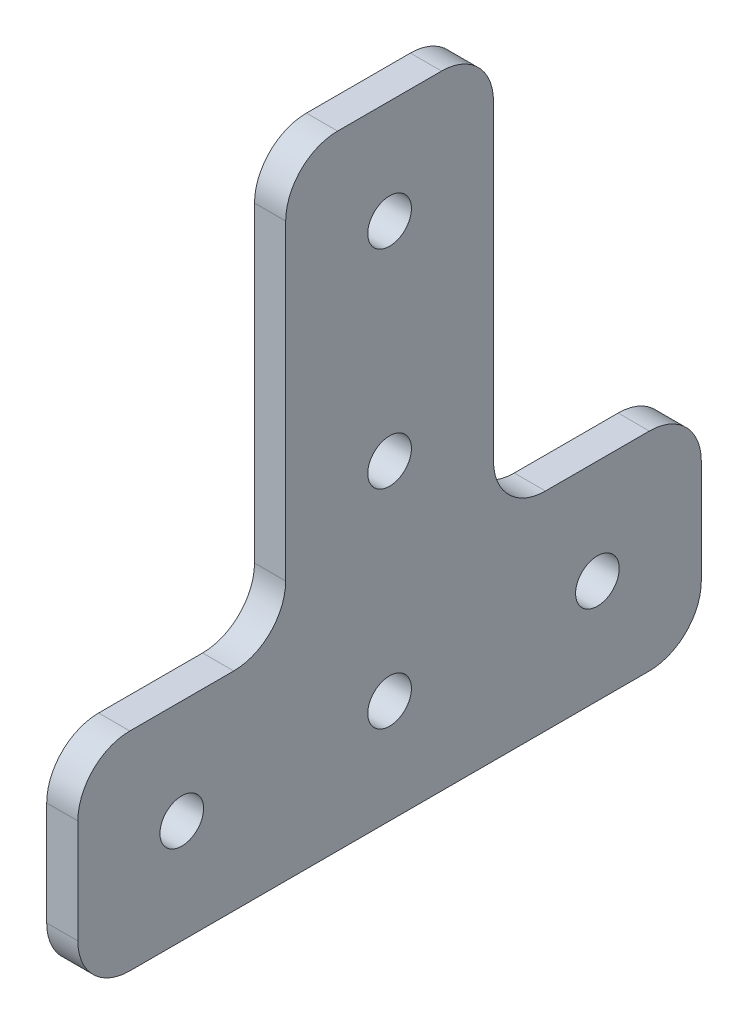
ISO-10303-21;
HEADER;
FILE_DESCRIPTION(('STEP AP214'),'2;1');
FILE_NAME('part.step','',(''),(''),'','','');
FILE_SCHEMA(('AUTOMOTIVE_DESIGN { 1 0 10303 214 1 1 1 1 }'));
ENDSEC;
DATA;
#1=APPLICATION_CONTEXT('core data for automotive mechanical design processes');
#2=APPLICATION_PROTOCOL_DEFINITION('international standard','automotive_design',2000,#1);
#3=PRODUCT_CONTEXT('',#1,'mechanical');
#4=PRODUCT('Part','Part','',(#3));
#5=PRODUCT_RELATED_PRODUCT_CATEGORY('part','',(#4));
#6=PRODUCT_DEFINITION_FORMATION('','',#4);
#7=PRODUCT_DEFINITION_CONTEXT('part definition',#1,'design');
#8=PRODUCT_DEFINITION('design','',#6,#7);
#9=PRODUCT_DEFINITION_SHAPE('','',#8);
#10=(LENGTH_UNIT() NAMED_UNIT(*) SI_UNIT(.MILLI.,.METRE.));
#11=(NAMED_UNIT(*) PLANE_ANGLE_UNIT() SI_UNIT($,.RADIAN.));
#12=(NAMED_UNIT(*) SI_UNIT($,.STERADIAN.) SOLID_ANGLE_UNIT());
#13=UNCERTAINTY_MEASURE_WITH_UNIT(LENGTH_MEASURE(1.E-05),#10,'distance_accuracy_value','');
#14=(GEOMETRIC_REPRESENTATION_CONTEXT(3) GLOBAL_UNCERTAINTY_ASSIGNED_CONTEXT((#13)) GLOBAL_UNIT_ASSIGNED_CONTEXT((#10,
#11,#12)) REPRESENTATION_CONTEXT('',''));
#15=CARTESIAN_POINT('',(0.,0.,0.));
#16=DIRECTION('',(0.,0.,1.));
#17=DIRECTION('',(1.,0.,0.));
#18=AXIS2_PLACEMENT_3D('',#15,#16,#17);
#19=CARTESIAN_POINT('',(3.,0.,0.));
#20=DIRECTION('',(1.,0.,0.));
#21=DIRECTION('',(0.,0.,-1.));
#22=AXIS2_PLACEMENT_3D('',#19,#20,#21);
#23=PLANE('',#22);
#24=CARTESIAN_POINT('',(3.,20.,0.));
#25=DIRECTION('',(1.,0.,0.));
#26=DIRECTION('',(0.,0.,-1.));
#27=AXIS2_PLACEMENT_3D('',#24,#25,#26);
#28=CIRCLE('',#27,2.1);
#29=CARTESIAN_POINT('',(3.,20.,-2.09999999999994));
#30=VERTEX_POINT('',#29);
#31=EDGE_CURVE('E590',#30,#30,#28,.T.);
#32=ORIENTED_EDGE('',*,*,#31,.F.);
#33=EDGE_LOOP('',(#32));
#34=FACE_BOUND('',#33,.T.);
#35=CARTESIAN_POINT('',(3.,0.,20.));
#36=DIRECTION('',(1.,0.,0.));
#37=DIRECTION('',(0.,0.,-1.));
#38=AXIS2_PLACEMENT_3D('',#35,#36,#37);
#39=CIRCLE('',#38,2.1);
#40=CARTESIAN_POINT('',(3.,0.,17.9));
#41=VERTEX_POINT('',#40);
#42=EDGE_CURVE('E606',#41,#41,#39,.T.);
#43=ORIENTED_EDGE('',*,*,#42,.F.);
#44=EDGE_LOOP('',(#43));
#45=FACE_BOUND('',#44,.T.);
#46=DIRECTION('',(0.,0.,1.));
#47=VECTOR('',#46,1.);
#48=CARTESIAN_POINT('',(3.,50.,10.));
#49=LINE('',#48,#47);
#50=CARTESIAN_POINT('',(3.,50.,-5.));
#51=VERTEX_POINT('',#50);
#52=CARTESIAN_POINT('',(3.,50.,5.));
#53=VERTEX_POINT('',#52);
#54=EDGE_CURVE('E298',#51,#53,#49,.T.);
#55=ORIENTED_EDGE('',*,*,#54,.T.);
#56=CARTESIAN_POINT('',(3.,45.,5.));
#57=DIRECTION('',(1.,0.,0.));
#58=DIRECTION('',(0.,0.,-1.));
#59=AXIS2_PLACEMENT_3D('',#56,#57,#58);
#60=CIRCLE('',#59,5.);
#61=CARTESIAN_POINT('',(3.,45.,10.));
#62=VERTEX_POINT('',#61);
#63=EDGE_CURVE('E237',#53,#62,#60,.T.);
#64=ORIENTED_EDGE('',*,*,#63,.T.);
#65=DIRECTION('',(0.,-1.,0.));
#66=VECTOR('',#65,1.);
#67=CARTESIAN_POINT('',(3.,10.,10.));
#68=LINE('',#67,#66);
#69=CARTESIAN_POINT('',(3.,15.,10.));
#70=VERTEX_POINT('',#69);
#71=EDGE_CURVE('E174',#62,#70,#68,.T.);
#72=ORIENTED_EDGE('',*,*,#71,.T.);
#73=CARTESIAN_POINT('',(3.,15.,15.));
#74=DIRECTION('',(1.,0.,0.));
#75=DIRECTION('',(0.,0.,-1.));
#76=AXIS2_PLACEMENT_3D('',#73,#74,#75);
#77=CIRCLE('',#76,5.);
#78=CARTESIAN_POINT('',(3.,10.,15.));
#79=VERTEX_POINT('',#78);
#80=EDGE_CURVE('E11',#70,#79,#77,.F.);
#81=ORIENTED_EDGE('',*,*,#80,.T.);
#82=DIRECTION('',(0.,0.,1.));
#83=VECTOR('',#82,1.);
#84=CARTESIAN_POINT('',(3.,10.,30.));
#85=LINE('',#84,#83);
#86=CARTESIAN_POINT('',(3.,10.,25.));
#87=VERTEX_POINT('',#86);
#88=EDGE_CURVE('E292',#79,#87,#85,.T.);
#89=ORIENTED_EDGE('',*,*,#88,.T.);
#90=CARTESIAN_POINT('',(3.,5.,25.));
#91=DIRECTION('',(1.,0.,0.));
#92=DIRECTION('',(0.,0.,-1.));
#93=AXIS2_PLACEMENT_3D('',#90,#91,#92);
#94=CIRCLE('',#93,5.);
#95=CARTESIAN_POINT('',(3.,5.,30.));
#96=VERTEX_POINT('',#95);
#97=EDGE_CURVE('E225',#87,#96,#94,.T.);
#98=ORIENTED_EDGE('',*,*,#97,.T.);
#99=DIRECTION('',(0.,-1.,0.));
#100=VECTOR('',#99,1.);
#101=CARTESIAN_POINT('',(3.,10.,30.));
#102=LINE('',#101,#100);
#103=CARTESIAN_POINT('',(3.,-5.,30.));
#104=VERTEX_POINT('',#103);
#105=EDGE_CURVE('E289',#96,#104,#102,.T.);
#106=ORIENTED_EDGE('',*,*,#105,.T.);
#107=CARTESIAN_POINT('',(3.,-5.,25.));
#108=DIRECTION('',(1.,0.,0.));
#109=DIRECTION('',(0.,0.,-1.));
#110=AXIS2_PLACEMENT_3D('',#107,#108,#109);
#111=CIRCLE('',#110,5.);
#112=CARTESIAN_POINT('',(3.,-10.,25.));
#113=VERTEX_POINT('',#112);
#114=EDGE_CURVE('E61',#104,#113,#111,.T.);
#115=ORIENTED_EDGE('',*,*,#114,.T.);
#116=DIRECTION('',(0.,0.,-1.));
#117=VECTOR('',#116,1.);
#118=CARTESIAN_POINT('',(3.,-10.,30.));
#119=LINE('',#118,#117);
#120=CARTESIAN_POINT('',(3.,-10.,-25.));
#121=VERTEX_POINT('',#120);
#122=EDGE_CURVE('E203',#113,#121,#119,.T.);
#123=ORIENTED_EDGE('',*,*,#122,.T.);
#124=CARTESIAN_POINT('',(3.,-5.,-25.));
#125=DIRECTION('',(1.,0.,0.));
#126=DIRECTION('',(0.,0.,-1.));
#127=AXIS2_PLACEMENT_3D('',#124,#125,#126);
#128=CIRCLE('',#127,5.);
#129=CARTESIAN_POINT('',(3.,-5.,-30.));
#130=VERTEX_POINT('',#129);
#131=EDGE_CURVE('E228',#121,#130,#128,.T.);
#132=ORIENTED_EDGE('',*,*,#131,.T.);
#133=DIRECTION('',(0.,1.,0.));
#134=VECTOR('',#133,1.);
#135=CARTESIAN_POINT('',(3.,10.,-30.));
#136=LINE('',#135,#134);
#137=CARTESIAN_POINT('',(3.,5.,-30.));
#138=VERTEX_POINT('',#137);
#139=EDGE_CURVE('E201',#130,#138,#136,.T.);
#140=ORIENTED_EDGE('',*,*,#139,.T.);
#141=CARTESIAN_POINT('',(3.,5.,-25.));
#142=DIRECTION('',(1.,0.,0.));
#143=DIRECTION('',(0.,0.,-1.));
#144=AXIS2_PLACEMENT_3D('',#141,#142,#143);
#145=CIRCLE('',#144,5.);
#146=CARTESIAN_POINT('',(3.,10.,-25.));
#147=VERTEX_POINT('',#146);
#148=EDGE_CURVE('E231',#138,#147,#145,.T.);
#149=ORIENTED_EDGE('',*,*,#148,.T.);
#150=DIRECTION('',(0.,0.,1.));
#151=VECTOR('',#150,1.);
#152=CARTESIAN_POINT('',(3.,10.,-10.));
#153=LINE('',#152,#151);
#154=CARTESIAN_POINT('',(3.,10.,-15.));
#155=VERTEX_POINT('',#154);
#156=EDGE_CURVE('E306',#147,#155,#153,.T.);
#157=ORIENTED_EDGE('',*,*,#156,.T.);
#158=CARTESIAN_POINT('',(3.,15.,-15.));
#159=DIRECTION('',(1.,0.,0.));
#160=DIRECTION('',(0.,0.,-1.));
#161=AXIS2_PLACEMENT_3D('',#158,#159,#160);
#162=CIRCLE('',#161,5.);
#163=CARTESIAN_POINT('',(3.,15.,-10.));
#164=VERTEX_POINT('',#163);
#165=EDGE_CURVE('E284',#155,#164,#162,.F.);
#166=ORIENTED_EDGE('',*,*,#165,.T.);
#167=DIRECTION('',(0.,1.,0.));
#168=VECTOR('',#167,1.);
#169=CARTESIAN_POINT('',(3.,50.,-10.));
#170=LINE('',#169,#168);
#171=CARTESIAN_POINT('',(3.,45.,-10.));
#172=VERTEX_POINT('',#171);
#173=EDGE_CURVE('E302',#164,#172,#170,.T.);
#174=ORIENTED_EDGE('',*,*,#173,.T.);
#175=CARTESIAN_POINT('',(3.,45.,-5.));
#176=DIRECTION('',(1.,0.,0.));
#177=DIRECTION('',(0.,0.,-1.));
#178=AXIS2_PLACEMENT_3D('',#175,#176,#177);
#179=CIRCLE('',#178,5.);
#180=EDGE_CURVE('E234',#172,#51,#179,.T.);
#181=ORIENTED_EDGE('',*,*,#180,.T.);
#182=EDGE_LOOP('',(#55,#64,#72,#81,#89,#98,#106,#115,#123,#132,#140,#149,#157,#166,#174,#181));
#183=FACE_BOUND('',#182,.T.);
#184=CARTESIAN_POINT('',(3.,0.,0.));
#185=DIRECTION('',(1.,0.,0.));
#186=DIRECTION('',(0.,0.,-1.));
#187=AXIS2_PLACEMENT_3D('',#184,#185,#186);
#188=CIRCLE('',#187,2.1);
#189=CARTESIAN_POINT('',(3.,0.,-2.10000000000001));
#190=VERTEX_POINT('',#189);
#191=EDGE_CURVE('E324',#190,#190,#188,.T.);
#192=ORIENTED_EDGE('',*,*,#191,.F.);
#193=EDGE_LOOP('',(#192));
#194=FACE_BOUND('',#193,.T.);
#195=CARTESIAN_POINT('',(3.,0.,-20.));
#196=DIRECTION('',(1.,0.,0.));
#197=DIRECTION('',(0.,0.,-1.));
#198=AXIS2_PLACEMENT_3D('',#195,#196,#197);
#199=CIRCLE('',#198,2.1);
#200=CARTESIAN_POINT('',(3.,0.,-22.1));
#201=VERTEX_POINT('',#200);
#202=EDGE_CURVE('E598',#201,#201,#199,.T.);
#203=ORIENTED_EDGE('',*,*,#202,.F.);
#204=EDGE_LOOP('',(#203));
#205=FACE_BOUND('',#204,.T.);
#206=CARTESIAN_POINT('',(3.,40.,1.2680161909957E-13));
#207=DIRECTION('',(1.,0.,0.));
#208=DIRECTION('',(0.,0.,-1.));
#209=AXIS2_PLACEMENT_3D('',#206,#207,#208);
#210=CIRCLE('',#209,2.1);
#211=CARTESIAN_POINT('',(3.,40.,-2.09999999999987));
#212=VERTEX_POINT('',#211);
#213=EDGE_CURVE('E579',#212,#212,#210,.T.);
#214=ORIENTED_EDGE('',*,*,#213,.F.);
#215=EDGE_LOOP('',(#214));
#216=FACE_BOUND('',#215,.T.);
#217=ADVANCED_FACE('F38',(#34,#45,#183,#194,#205,#216),#23,.T.);
#218=CARTESIAN_POINT('',(0.,0.,0.));
#219=DIRECTION('',(1.,0.,0.));
#220=DIRECTION('',(0.,0.,-1.));
#221=AXIS2_PLACEMENT_3D('',#218,#219,#220);
#222=PLANE('',#221);
#223=DIRECTION('',(0.,-1.,0.));
#224=VECTOR('',#223,1.);
#225=CARTESIAN_POINT('',(0.,10.,10.));
#226=LINE('',#225,#224);
#227=CARTESIAN_POINT('',(0.,45.,10.));
#228=VERTEX_POINT('',#227);
#229=CARTESIAN_POINT('',(0.,15.,10.));
#230=VERTEX_POINT('',#229);
#231=EDGE_CURVE('E171',#228,#230,#226,.T.);
#232=ORIENTED_EDGE('',*,*,#231,.F.);
#233=CARTESIAN_POINT('',(0.,45.,5.));
#234=DIRECTION('',(1.,0.,0.));
#235=DIRECTION('',(0.,0.,-1.));
#236=AXIS2_PLACEMENT_3D('',#233,#234,#235);
#237=CIRCLE('',#236,5.);
#238=CARTESIAN_POINT('',(0.,50.,5.));
#239=VERTEX_POINT('',#238);
#240=EDGE_CURVE('E153',#228,#239,#237,.F.);
#241=ORIENTED_EDGE('',*,*,#240,.T.);
#242=DIRECTION('',(0.,0.,1.));
#243=VECTOR('',#242,1.);
#244=CARTESIAN_POINT('',(0.,50.,10.));
#245=LINE('',#244,#243);
#246=CARTESIAN_POINT('',(0.,50.,-5.));
#247=VERTEX_POINT('',#246);
#248=EDGE_CURVE('E184',#247,#239,#245,.T.);
#249=ORIENTED_EDGE('',*,*,#248,.F.);
#250=CARTESIAN_POINT('',(0.,45.,-5.));
#251=DIRECTION('',(1.,0.,0.));
#252=DIRECTION('',(0.,0.,-1.));
#253=AXIS2_PLACEMENT_3D('',#250,#251,#252);
#254=CIRCLE('',#253,5.);
#255=CARTESIAN_POINT('',(0.,45.,-10.));
#256=VERTEX_POINT('',#255);
#257=EDGE_CURVE('E165',#247,#256,#254,.F.);
#258=ORIENTED_EDGE('',*,*,#257,.T.);
#259=DIRECTION('',(0.,1.,0.));
#260=VECTOR('',#259,1.);
#261=CARTESIAN_POINT('',(0.,50.,-10.));
#262=LINE('',#261,#260);
#263=CARTESIAN_POINT('',(0.,15.,-10.));
#264=VERTEX_POINT('',#263);
#265=EDGE_CURVE('E191',#264,#256,#262,.T.);
#266=ORIENTED_EDGE('',*,*,#265,.F.);
#267=CARTESIAN_POINT('',(0.,15.,-15.));
#268=DIRECTION('',(1.,0.,0.));
#269=DIRECTION('',(0.,0.,-1.));
#270=AXIS2_PLACEMENT_3D('',#267,#268,#269);
#271=CIRCLE('',#270,5.);
#272=CARTESIAN_POINT('',(0.,10.,-15.));
#273=VERTEX_POINT('',#272);
#274=EDGE_CURVE('E281',#264,#273,#271,.T.);
#275=ORIENTED_EDGE('',*,*,#274,.T.);
#276=DIRECTION('',(0.,0.,1.));
#277=VECTOR('',#276,1.);
#278=CARTESIAN_POINT('',(0.,10.,-10.));
#279=LINE('',#278,#277);
#280=CARTESIAN_POINT('',(0.,10.,-25.));
#281=VERTEX_POINT('',#280);
#282=EDGE_CURVE('E323',#281,#273,#279,.T.);
#283=ORIENTED_EDGE('',*,*,#282,.F.);
#284=CARTESIAN_POINT('',(0.,5.,-25.));
#285=DIRECTION('',(1.,0.,0.));
#286=DIRECTION('',(0.,0.,-1.));
#287=AXIS2_PLACEMENT_3D('',#284,#285,#286);
#288=CIRCLE('',#287,5.);
#289=CARTESIAN_POINT('',(0.,5.,-30.));
#290=VERTEX_POINT('',#289);
#291=EDGE_CURVE('E213',#281,#290,#288,.F.);
#292=ORIENTED_EDGE('',*,*,#291,.T.);
#293=DIRECTION('',(0.,1.,0.));
#294=VECTOR('',#293,1.);
#295=CARTESIAN_POINT('',(0.,10.,-30.));
#296=LINE('',#295,#294);
#297=CARTESIAN_POINT('',(0.,-5.,-30.));
#298=VERTEX_POINT('',#297);
#299=EDGE_CURVE('E319',#298,#290,#296,.T.);
#300=ORIENTED_EDGE('',*,*,#299,.F.);
#301=CARTESIAN_POINT('',(0.,-5.,-25.));
#302=DIRECTION('',(1.,0.,0.));
#303=DIRECTION('',(0.,0.,-1.));
#304=AXIS2_PLACEMENT_3D('',#301,#302,#303);
#305=CIRCLE('',#304,5.);
#306=CARTESIAN_POINT('',(0.,-10.,-25.));
#307=VERTEX_POINT('',#306);
#308=EDGE_CURVE('E210',#298,#307,#305,.F.);
#309=ORIENTED_EDGE('',*,*,#308,.T.);
#310=DIRECTION('',(0.,0.,-1.));
#311=VECTOR('',#310,1.);
#312=CARTESIAN_POINT('',(0.,-10.,30.));
#313=LINE('',#312,#311);
#314=CARTESIAN_POINT('',(0.,-10.,25.));
#315=VERTEX_POINT('',#314);
#316=EDGE_CURVE('E198',#315,#307,#313,.T.);
#317=ORIENTED_EDGE('',*,*,#316,.F.);
#318=CARTESIAN_POINT('',(0.,-5.,25.));
#319=DIRECTION('',(1.,0.,0.));
#320=DIRECTION('',(0.,0.,-1.));
#321=AXIS2_PLACEMENT_3D('',#318,#319,#320);
#322=CIRCLE('',#321,5.);
#323=CARTESIAN_POINT('',(0.,-5.,30.));
#324=VERTEX_POINT('',#323);
#325=EDGE_CURVE('E176',#315,#324,#322,.F.);
#326=ORIENTED_EDGE('',*,*,#325,.T.);
#327=DIRECTION('',(0.,-1.,0.));
#328=VECTOR('',#327,1.);
#329=CARTESIAN_POINT('',(0.,10.,30.));
#330=LINE('',#329,#328);
#331=CARTESIAN_POINT('',(0.,5.,30.));
#332=VERTEX_POINT('',#331);
#333=EDGE_CURVE('E189',#332,#324,#330,.T.);
#334=ORIENTED_EDGE('',*,*,#333,.F.);
#335=CARTESIAN_POINT('',(0.,5.,25.));
#336=DIRECTION('',(1.,0.,0.));
#337=DIRECTION('',(0.,0.,-1.));
#338=AXIS2_PLACEMENT_3D('',#335,#336,#337);
#339=CIRCLE('',#338,5.);
#340=CARTESIAN_POINT('',(0.,10.,25.));
#341=VERTEX_POINT('',#340);
#342=EDGE_CURVE('E207',#332,#341,#339,.F.);
#343=ORIENTED_EDGE('',*,*,#342,.T.);
#344=DIRECTION('',(0.,0.,1.));
#345=VECTOR('',#344,1.);
#346=CARTESIAN_POINT('',(0.,10.,30.));
#347=LINE('',#346,#345);
#348=CARTESIAN_POINT('',(0.,10.,15.));
#349=VERTEX_POINT('',#348);
#350=EDGE_CURVE('E183',#349,#341,#347,.T.);
#351=ORIENTED_EDGE('',*,*,#350,.F.);
#352=CARTESIAN_POINT('',(0.,15.,15.));
#353=DIRECTION('',(1.,0.,0.));
#354=DIRECTION('',(0.,0.,-1.));
#355=AXIS2_PLACEMENT_3D('',#352,#353,#354);
#356=CIRCLE('',#355,5.);
#357=EDGE_CURVE('E47',#349,#230,#356,.T.);
#358=ORIENTED_EDGE('',*,*,#357,.T.);
#359=EDGE_LOOP('',(#232,#241,#249,#258,#266,#275,#283,#292,#300,#309,#317,#326,#334,#343,#351,#358));
#360=FACE_BOUND('',#359,.T.);
#361=CARTESIAN_POINT('',(0.,0.,0.));
#362=DIRECTION('',(1.,0.,0.));
#363=DIRECTION('',(0.,0.,-1.));
#364=AXIS2_PLACEMENT_3D('',#361,#362,#363);
#365=CIRCLE('',#364,2.1);
#366=CARTESIAN_POINT('',(0.,0.,-2.10000000000001));
#367=VERTEX_POINT('',#366);
#368=EDGE_CURVE('E316',#367,#367,#365,.T.);
#369=ORIENTED_EDGE('',*,*,#368,.T.);
#370=EDGE_LOOP('',(#369));
#371=FACE_BOUND('',#370,.T.);
#372=CARTESIAN_POINT('',(0.,0.,20.));
#373=DIRECTION('',(1.,0.,0.));
#374=DIRECTION('',(0.,0.,-1.));
#375=AXIS2_PLACEMENT_3D('',#372,#373,#374);
#376=CIRCLE('',#375,2.1);
#377=CARTESIAN_POINT('',(0.,0.,17.9));
#378=VERTEX_POINT('',#377);
#379=EDGE_CURVE('E602',#378,#378,#376,.T.);
#380=ORIENTED_EDGE('',*,*,#379,.T.);
#381=EDGE_LOOP('',(#380));
#382=FACE_BOUND('',#381,.T.);
#383=CARTESIAN_POINT('',(0.,0.,-20.));
#384=DIRECTION('',(1.,0.,0.));
#385=DIRECTION('',(0.,0.,-1.));
#386=AXIS2_PLACEMENT_3D('',#383,#384,#385);
#387=CIRCLE('',#386,2.1);
#388=CARTESIAN_POINT('',(0.,0.,-22.1));
#389=VERTEX_POINT('',#388);
#390=EDGE_CURVE('E594',#389,#389,#387,.T.);
#391=ORIENTED_EDGE('',*,*,#390,.T.);
#392=EDGE_LOOP('',(#391));
#393=FACE_BOUND('',#392,.T.);
#394=CARTESIAN_POINT('',(0.,20.,0.));
#395=DIRECTION('',(1.,0.,0.));
#396=DIRECTION('',(0.,0.,-1.));
#397=AXIS2_PLACEMENT_3D('',#394,#395,#396);
#398=CIRCLE('',#397,2.1);
#399=CARTESIAN_POINT('',(0.,20.,-2.09999999999994));
#400=VERTEX_POINT('',#399);
#401=EDGE_CURVE('E587',#400,#400,#398,.T.);
#402=ORIENTED_EDGE('',*,*,#401,.T.);
#403=EDGE_LOOP('',(#402));
#404=FACE_BOUND('',#403,.T.);
#405=CARTESIAN_POINT('',(0.,40.,1.2680161909957E-13));
#406=DIRECTION('',(1.,0.,0.));
#407=DIRECTION('',(0.,0.,-1.));
#408=AXIS2_PLACEMENT_3D('',#405,#406,#407);
#409=CIRCLE('',#408,2.1);
#410=CARTESIAN_POINT('',(0.,40.,-2.09999999999987));
#411=VERTEX_POINT('',#410);
#412=EDGE_CURVE('E582',#411,#411,#409,.T.);
#413=ORIENTED_EDGE('',*,*,#412,.T.);
#414=EDGE_LOOP('',(#413));
#415=FACE_BOUND('',#414,.T.);
#416=ADVANCED_FACE('F179',(#360,#371,#382,#393,#404,#415),#222,.F.);
#417=CARTESIAN_POINT('',(3.,10.,-30.));
#418=DIRECTION('',(0.,0.,1.));
#419=DIRECTION('',(1.,0.,0.));
#420=AXIS2_PLACEMENT_3D('',#417,#418,#419);
#421=PLANE('',#420);
#422=ORIENTED_EDGE('',*,*,#299,.T.);
#423=DIRECTION('',(-1.,0.,0.));
#424=VECTOR('',#423,1.);
#425=CARTESIAN_POINT('',(3.,5.,-30.));
#426=LINE('',#425,#424);
#427=EDGE_CURVE('E258',#290,#138,#426,.F.);
#428=ORIENTED_EDGE('',*,*,#427,.T.);
#429=ORIENTED_EDGE('',*,*,#139,.F.);
#430=DIRECTION('',(-1.,0.,0.));
#431=VECTOR('',#430,1.);
#432=CARTESIAN_POINT('',(3.,-5.,-30.));
#433=LINE('',#432,#431);
#434=EDGE_CURVE('E254',#130,#298,#433,.T.);
#435=ORIENTED_EDGE('',*,*,#434,.T.);
#436=EDGE_LOOP('',(#422,#428,#429,#435));
#437=FACE_BOUND('',#436,.T.);
#438=ADVANCED_FACE('F360',(#437),#421,.F.);
#439=CARTESIAN_POINT('',(3.,10.,-10.));
#440=DIRECTION('',(0.,-1.,0.));
#441=DIRECTION('',(0.,0.,-1.));
#442=AXIS2_PLACEMENT_3D('',#439,#440,#441);
#443=PLANE('',#442);
#444=ORIENTED_EDGE('',*,*,#282,.T.);
#445=DIRECTION('',(-1.,0.,0.));
#446=VECTOR('',#445,1.);
#447=CARTESIAN_POINT('',(3.,10.,-15.));
#448=LINE('',#447,#446);
#449=EDGE_CURVE('E251',#273,#155,#448,.F.);
#450=ORIENTED_EDGE('',*,*,#449,.T.);
#451=ORIENTED_EDGE('',*,*,#156,.F.);
#452=DIRECTION('',(-1.,0.,0.));
#453=VECTOR('',#452,1.);
#454=CARTESIAN_POINT('',(3.,10.,-25.));
#455=LINE('',#454,#453);
#456=EDGE_CURVE('E247',#147,#281,#455,.T.);
#457=ORIENTED_EDGE('',*,*,#456,.T.);
#458=EDGE_LOOP('',(#444,#450,#451,#457));
#459=FACE_BOUND('',#458,.T.);
#460=ADVANCED_FACE('F351',(#459),#443,.F.);
#461=CARTESIAN_POINT('',(3.,50.,-10.));
#462=DIRECTION('',(0.,0.,1.));
#463=DIRECTION('',(0.,-1.,0.));
#464=AXIS2_PLACEMENT_3D('',#461,#462,#463);
#465=PLANE('',#464);
#466=ORIENTED_EDGE('',*,*,#265,.T.);
#467=DIRECTION('',(-1.,0.,0.));
#468=VECTOR('',#467,1.);
#469=CARTESIAN_POINT('',(3.,45.,-10.));
#470=LINE('',#469,#468);
#471=EDGE_CURVE('E244',#256,#172,#470,.F.);
#472=ORIENTED_EDGE('',*,*,#471,.T.);
#473=ORIENTED_EDGE('',*,*,#173,.F.);
#474=DIRECTION('',(-1.,0.,0.));
#475=VECTOR('',#474,1.);
#476=CARTESIAN_POINT('',(0.,15.,-10.));
#477=LINE('',#476,#475);
#478=EDGE_CURVE('E240',#164,#264,#477,.T.);
#479=ORIENTED_EDGE('',*,*,#478,.T.);
#480=EDGE_LOOP('',(#466,#472,#473,#479));
#481=FACE_BOUND('',#480,.T.);
#482=ADVANCED_FACE('F332',(#481),#465,.F.);
#483=CARTESIAN_POINT('',(3.,50.,10.));
#484=DIRECTION('',(0.,-1.,0.));
#485=DIRECTION('',(0.,0.,-1.));
#486=AXIS2_PLACEMENT_3D('',#483,#484,#485);
#487=PLANE('',#486);
#488=ORIENTED_EDGE('',*,*,#248,.T.);
#489=DIRECTION('',(-1.,0.,0.));
#490=VECTOR('',#489,1.);
#491=CARTESIAN_POINT('',(3.,50.,5.));
#492=LINE('',#491,#490);
#493=EDGE_CURVE('E158',#239,#53,#492,.F.);
#494=ORIENTED_EDGE('',*,*,#493,.T.);
#495=ORIENTED_EDGE('',*,*,#54,.F.);
#496=DIRECTION('',(-1.,0.,0.));
#497=VECTOR('',#496,1.);
#498=CARTESIAN_POINT('',(3.,50.,-5.));
#499=LINE('',#498,#497);
#500=EDGE_CURVE('E164',#51,#247,#499,.T.);
#501=ORIENTED_EDGE('',*,*,#500,.T.);
#502=EDGE_LOOP('',(#488,#494,#495,#501));
#503=FACE_BOUND('',#502,.T.);
#504=ADVANCED_FACE('F342',(#503),#487,.F.);
#505=CARTESIAN_POINT('',(3.,10.,10.));
#506=DIRECTION('',(0.,0.,-1.));
#507=DIRECTION('',(-1.,0.,0.));
#508=AXIS2_PLACEMENT_3D('',#505,#506,#507);
#509=PLANE('',#508);
#510=ORIENTED_EDGE('',*,*,#71,.F.);
#511=DIRECTION('',(-1.,0.,0.));
#512=VECTOR('',#511,1.);
#513=CARTESIAN_POINT('',(3.,45.,10.));
#514=LINE('',#513,#512);
#515=EDGE_CURVE('E157',#62,#228,#514,.T.);
#516=ORIENTED_EDGE('',*,*,#515,.T.);
#517=ORIENTED_EDGE('',*,*,#231,.T.);
#518=DIRECTION('',(-1.,0.,0.));
#519=VECTOR('',#518,1.);
#520=CARTESIAN_POINT('',(3.,15.,10.));
#521=LINE('',#520,#519);
#522=EDGE_CURVE('E177',#230,#70,#521,.F.);
#523=ORIENTED_EDGE('',*,*,#522,.T.);
#524=EDGE_LOOP('',(#510,#516,#517,#523));
#525=FACE_BOUND('',#524,.T.);
#526=ADVANCED_FACE('F170',(#525),#509,.F.);
#527=CARTESIAN_POINT('',(3.,10.,30.));
#528=DIRECTION('',(0.,-1.,0.));
#529=DIRECTION('',(0.,0.,-1.));
#530=AXIS2_PLACEMENT_3D('',#527,#528,#529);
#531=PLANE('',#530);
#532=ORIENTED_EDGE('',*,*,#88,.F.);
#533=DIRECTION('',(-1.,0.,0.));
#534=VECTOR('',#533,1.);
#535=CARTESIAN_POINT('',(0.,10.,15.));
#536=LINE('',#535,#534);
#537=EDGE_CURVE('E270',#79,#349,#536,.T.);
#538=ORIENTED_EDGE('',*,*,#537,.T.);
#539=ORIENTED_EDGE('',*,*,#350,.T.);
#540=DIRECTION('',(-1.,0.,0.));
#541=VECTOR('',#540,1.);
#542=CARTESIAN_POINT('',(3.,10.,25.));
#543=LINE('',#542,#541);
#544=EDGE_CURVE('E267',#341,#87,#543,.F.);
#545=ORIENTED_EDGE('',*,*,#544,.T.);
#546=EDGE_LOOP('',(#532,#538,#539,#545));
#547=FACE_BOUND('',#546,.T.);
#548=ADVANCED_FACE('F349',(#547),#531,.F.);
#549=CARTESIAN_POINT('',(3.,10.,30.));
#550=DIRECTION('',(0.,0.,-1.));
#551=DIRECTION('',(-1.,0.,0.));
#552=AXIS2_PLACEMENT_3D('',#549,#550,#551);
#553=PLANE('',#552);
#554=ORIENTED_EDGE('',*,*,#105,.F.);
#555=DIRECTION('',(-1.,0.,0.));
#556=VECTOR('',#555,1.);
#557=CARTESIAN_POINT('',(3.,5.,30.));
#558=LINE('',#557,#556);
#559=EDGE_CURVE('E277',#96,#332,#558,.T.);
#560=ORIENTED_EDGE('',*,*,#559,.T.);
#561=ORIENTED_EDGE('',*,*,#333,.T.);
#562=DIRECTION('',(-1.,0.,0.));
#563=VECTOR('',#562,1.);
#564=CARTESIAN_POINT('',(3.,-5.,30.));
#565=LINE('',#564,#563);
#566=EDGE_CURVE('E274',#324,#104,#565,.F.);
#567=ORIENTED_EDGE('',*,*,#566,.T.);
#568=EDGE_LOOP('',(#554,#560,#561,#567));
#569=FACE_BOUND('',#568,.T.);
#570=ADVANCED_FACE('F371',(#569),#553,.F.);
#571=CARTESIAN_POINT('',(3.,-10.,30.));
#572=DIRECTION('',(0.,1.,0.));
#573=DIRECTION('',(0.,0.,1.));
#574=AXIS2_PLACEMENT_3D('',#571,#572,#573);
#575=PLANE('',#574);
#576=ORIENTED_EDGE('',*,*,#316,.T.);
#577=DIRECTION('',(-1.,0.,0.));
#578=VECTOR('',#577,1.);
#579=CARTESIAN_POINT('',(3.,-10.,-25.));
#580=LINE('',#579,#578);
#581=EDGE_CURVE('E54',#307,#121,#580,.F.);
#582=ORIENTED_EDGE('',*,*,#581,.T.);
#583=ORIENTED_EDGE('',*,*,#122,.F.);
#584=DIRECTION('',(-1.,0.,0.));
#585=VECTOR('',#584,1.);
#586=CARTESIAN_POINT('',(3.,-10.,25.));
#587=LINE('',#586,#585);
#588=EDGE_CURVE('E261',#113,#315,#587,.T.);
#589=ORIENTED_EDGE('',*,*,#588,.T.);
#590=EDGE_LOOP('',(#576,#582,#583,#589));
#591=FACE_BOUND('',#590,.T.);
#592=ADVANCED_FACE('F368',(#591),#575,.F.);
#593=CARTESIAN_POINT('',(3.,0.,0.));
#594=DIRECTION('',(-1.,0.,0.));
#595=DIRECTION('',(0.,0.,1.));
#596=AXIS2_PLACEMENT_3D('',#593,#594,#595);
#597=CYLINDRICAL_SURFACE('',#596,2.1);
#598=ORIENTED_EDGE('',*,*,#191,.T.);
#599=EDGE_LOOP('',(#598));
#600=FACE_BOUND('',#599,.T.);
#601=ORIENTED_EDGE('',*,*,#368,.F.);
#602=EDGE_LOOP('',(#601));
#603=FACE_BOUND('',#602,.T.);
#604=ADVANCED_FACE('F365',(#600,#603),#597,.F.);
#605=CARTESIAN_POINT('',(3.,0.,20.));
#606=DIRECTION('',(-1.,0.,0.));
#607=DIRECTION('',(0.,0.,1.));
#608=AXIS2_PLACEMENT_3D('',#605,#606,#607);
#609=CYLINDRICAL_SURFACE('',#608,2.1);
#610=ORIENTED_EDGE('',*,*,#42,.T.);
#611=EDGE_LOOP('',(#610));
#612=FACE_BOUND('',#611,.T.);
#613=ORIENTED_EDGE('',*,*,#379,.F.);
#614=EDGE_LOOP('',(#613));
#615=FACE_BOUND('',#614,.T.);
#616=ADVANCED_FACE('F539',(#612,#615),#609,.F.);
#617=CARTESIAN_POINT('',(3.,0.,-20.));
#618=DIRECTION('',(-1.,0.,0.));
#619=DIRECTION('',(0.,0.,1.));
#620=AXIS2_PLACEMENT_3D('',#617,#618,#619);
#621=CYLINDRICAL_SURFACE('',#620,2.1);
#622=ORIENTED_EDGE('',*,*,#202,.T.);
#623=EDGE_LOOP('',(#622));
#624=FACE_BOUND('',#623,.T.);
#625=ORIENTED_EDGE('',*,*,#390,.F.);
#626=EDGE_LOOP('',(#625));
#627=FACE_BOUND('',#626,.T.);
#628=ADVANCED_FACE('F547',(#624,#627),#621,.F.);
#629=CARTESIAN_POINT('',(3.,20.,0.));
#630=DIRECTION('',(-1.,0.,0.));
#631=DIRECTION('',(0.,0.,1.));
#632=AXIS2_PLACEMENT_3D('',#629,#630,#631);
#633=CYLINDRICAL_SURFACE('',#632,2.1);
#634=ORIENTED_EDGE('',*,*,#31,.T.);
#635=EDGE_LOOP('',(#634));
#636=FACE_BOUND('',#635,.T.);
#637=ORIENTED_EDGE('',*,*,#401,.F.);
#638=EDGE_LOOP('',(#637));
#639=FACE_BOUND('',#638,.T.);
#640=ADVANCED_FACE('F555',(#636,#639),#633,.F.);
#641=CARTESIAN_POINT('',(3.,40.,1.2680161909957E-13));
#642=DIRECTION('',(-1.,0.,0.));
#643=DIRECTION('',(0.,0.,1.));
#644=AXIS2_PLACEMENT_3D('',#641,#642,#643);
#645=CYLINDRICAL_SURFACE('',#644,2.1);
#646=ORIENTED_EDGE('',*,*,#213,.T.);
#647=EDGE_LOOP('',(#646));
#648=FACE_BOUND('',#647,.T.);
#649=ORIENTED_EDGE('',*,*,#412,.F.);
#650=EDGE_LOOP('',(#649));
#651=FACE_BOUND('',#650,.T.);
#652=ADVANCED_FACE('F410',(#648,#651),#645,.F.);
#653=CARTESIAN_POINT('',(3.,45.,5.));
#654=DIRECTION('',(-1.,0.,0.));
#655=DIRECTION('',(0.,0.,1.));
#656=AXIS2_PLACEMENT_3D('',#653,#654,#655);
#657=CYLINDRICAL_SURFACE('',#656,5.);
#658=ORIENTED_EDGE('',*,*,#63,.F.);
#659=ORIENTED_EDGE('',*,*,#493,.F.);
#660=ORIENTED_EDGE('',*,*,#240,.F.);
#661=ORIENTED_EDGE('',*,*,#515,.F.);
#662=EDGE_LOOP('',(#658,#659,#660,#661));
#663=FACE_BOUND('',#662,.T.);
#664=ADVANCED_FACE('F156',(#663),#657,.T.);
#665=CARTESIAN_POINT('',(3.,45.,-5.));
#666=DIRECTION('',(-1.,0.,0.));
#667=DIRECTION('',(0.,0.,1.));
#668=AXIS2_PLACEMENT_3D('',#665,#666,#667);
#669=CYLINDRICAL_SURFACE('',#668,5.);
#670=ORIENTED_EDGE('',*,*,#180,.F.);
#671=ORIENTED_EDGE('',*,*,#471,.F.);
#672=ORIENTED_EDGE('',*,*,#257,.F.);
#673=ORIENTED_EDGE('',*,*,#500,.F.);
#674=EDGE_LOOP('',(#670,#671,#672,#673));
#675=FACE_BOUND('',#674,.T.);
#676=ADVANCED_FACE('F337',(#675),#669,.T.);
#677=CARTESIAN_POINT('',(3.,15.,-15.));
#678=DIRECTION('',(1.,0.,0.));
#679=DIRECTION('',(0.,0.,-1.));
#680=AXIS2_PLACEMENT_3D('',#677,#678,#679);
#681=CYLINDRICAL_SURFACE('',#680,5.);
#682=ORIENTED_EDGE('',*,*,#165,.F.);
#683=ORIENTED_EDGE('',*,*,#449,.F.);
#684=ORIENTED_EDGE('',*,*,#274,.F.);
#685=ORIENTED_EDGE('',*,*,#478,.F.);
#686=EDGE_LOOP('',(#682,#683,#684,#685));
#687=FACE_BOUND('',#686,.T.);
#688=ADVANCED_FACE('F401',(#687),#681,.F.);
#689=CARTESIAN_POINT('',(3.,5.,-25.));
#690=DIRECTION('',(-1.,0.,0.));
#691=DIRECTION('',(0.,0.,1.));
#692=AXIS2_PLACEMENT_3D('',#689,#690,#691);
#693=CYLINDRICAL_SURFACE('',#692,5.);
#694=ORIENTED_EDGE('',*,*,#148,.F.);
#695=ORIENTED_EDGE('',*,*,#427,.F.);
#696=ORIENTED_EDGE('',*,*,#291,.F.);
#697=ORIENTED_EDGE('',*,*,#456,.F.);
#698=EDGE_LOOP('',(#694,#695,#696,#697));
#699=FACE_BOUND('',#698,.T.);
#700=ADVANCED_FACE('F395',(#699),#693,.T.);
#701=CARTESIAN_POINT('',(3.,-5.,-25.));
#702=DIRECTION('',(-1.,0.,0.));
#703=DIRECTION('',(0.,0.,1.));
#704=AXIS2_PLACEMENT_3D('',#701,#702,#703);
#705=CYLINDRICAL_SURFACE('',#704,5.);
#706=ORIENTED_EDGE('',*,*,#131,.F.);
#707=ORIENTED_EDGE('',*,*,#581,.F.);
#708=ORIENTED_EDGE('',*,*,#308,.F.);
#709=ORIENTED_EDGE('',*,*,#434,.F.);
#710=EDGE_LOOP('',(#706,#707,#708,#709));
#711=FACE_BOUND('',#710,.T.);
#712=ADVANCED_FACE('F388',(#711),#705,.T.);
#713=CARTESIAN_POINT('',(3.,15.,15.));
#714=DIRECTION('',(1.,0.,0.));
#715=DIRECTION('',(0.,0.,-1.));
#716=AXIS2_PLACEMENT_3D('',#713,#714,#715);
#717=CYLINDRICAL_SURFACE('',#716,5.);
#718=ORIENTED_EDGE('',*,*,#80,.F.);
#719=ORIENTED_EDGE('',*,*,#522,.F.);
#720=ORIENTED_EDGE('',*,*,#357,.F.);
#721=ORIENTED_EDGE('',*,*,#537,.F.);
#722=EDGE_LOOP('',(#718,#719,#720,#721));
#723=FACE_BOUND('',#722,.T.);
#724=ADVANCED_FACE('F385',(#723),#717,.F.);
#725=CARTESIAN_POINT('',(3.,5.,25.));
#726=DIRECTION('',(-1.,0.,0.));
#727=DIRECTION('',(0.,0.,1.));
#728=AXIS2_PLACEMENT_3D('',#725,#726,#727);
#729=CYLINDRICAL_SURFACE('',#728,5.);
#730=ORIENTED_EDGE('',*,*,#97,.F.);
#731=ORIENTED_EDGE('',*,*,#544,.F.);
#732=ORIENTED_EDGE('',*,*,#342,.F.);
#733=ORIENTED_EDGE('',*,*,#559,.F.);
#734=EDGE_LOOP('',(#730,#731,#732,#733));
#735=FACE_BOUND('',#734,.T.);
#736=ADVANCED_FACE('F387',(#735),#729,.T.);
#737=CARTESIAN_POINT('',(3.,-5.,25.));
#738=DIRECTION('',(-1.,0.,0.));
#739=DIRECTION('',(0.,0.,1.));
#740=AXIS2_PLACEMENT_3D('',#737,#738,#739);
#741=CYLINDRICAL_SURFACE('',#740,5.);
#742=ORIENTED_EDGE('',*,*,#114,.F.);
#743=ORIENTED_EDGE('',*,*,#566,.F.);
#744=ORIENTED_EDGE('',*,*,#325,.F.);
#745=ORIENTED_EDGE('',*,*,#588,.F.);
#746=EDGE_LOOP('',(#742,#743,#744,#745));
#747=FACE_BOUND('',#746,.T.);
#748=ADVANCED_FACE('F40',(#747),#741,.T.);
#749=CLOSED_SHELL('',(#217,#416,#438,#460,#482,#504,#526,#548,#570,#592,#604,#616,#628,#640,
#652,#664,#676,#688,#700,#712,#724,#736,#748));
#750=MANIFOLD_SOLID_BREP('B2',#749);
#751=ADVANCED_BREP_SHAPE_REPRESENTATION('',(#18,#750),#14);
#752=SHAPE_DEFINITION_REPRESENTATION(#9,#751);
ENDSEC;
END-ISO-10303-21;
